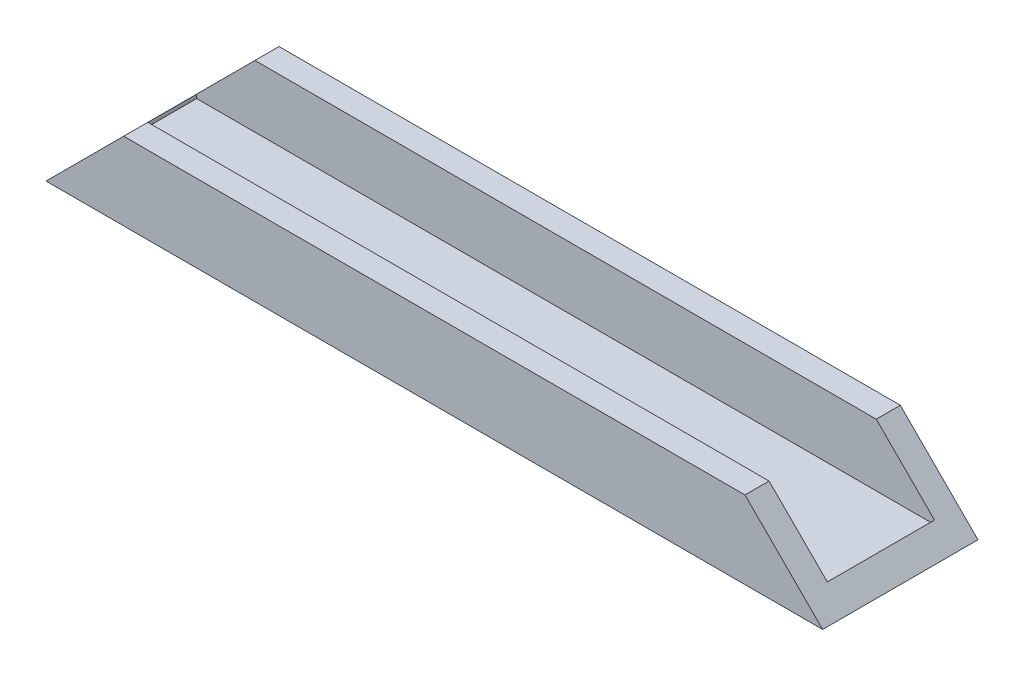
ISO-10303-21;
HEADER;
FILE_DESCRIPTION(('STEP AP214'),'2;1');
FILE_NAME('part.step','',(''),(''),'','','');
FILE_SCHEMA(('AUTOMOTIVE_DESIGN { 1 0 10303 214 1 1 1 1 }'));
ENDSEC;
DATA;
#1=APPLICATION_CONTEXT('core data for automotive mechanical design processes');
#2=APPLICATION_PROTOCOL_DEFINITION('international standard','automotive_design',2000,#1);
#3=PRODUCT_CONTEXT('',#1,'mechanical');
#4=PRODUCT('Part','Part','',(#3));
#5=PRODUCT_RELATED_PRODUCT_CATEGORY('part','',(#4));
#6=PRODUCT_DEFINITION_FORMATION('','',#4);
#7=PRODUCT_DEFINITION_CONTEXT('part definition',#1,'design');
#8=PRODUCT_DEFINITION('design','',#6,#7);
#9=PRODUCT_DEFINITION_SHAPE('','',#8);
#10=(LENGTH_UNIT() NAMED_UNIT(*) SI_UNIT(.MILLI.,.METRE.));
#11=(NAMED_UNIT(*) PLANE_ANGLE_UNIT() SI_UNIT($,.RADIAN.));
#12=(NAMED_UNIT(*) SI_UNIT($,.STERADIAN.) SOLID_ANGLE_UNIT());
#13=UNCERTAINTY_MEASURE_WITH_UNIT(LENGTH_MEASURE(1.E-05),#10,'distance_accuracy_value','');
#14=(GEOMETRIC_REPRESENTATION_CONTEXT(3) GLOBAL_UNCERTAINTY_ASSIGNED_CONTEXT((#13)) GLOBAL_UNIT_ASSIGNED_CONTEXT((#10,
#11,#12)) REPRESENTATION_CONTEXT('',''));
#15=CARTESIAN_POINT('',(0.,0.,0.));
#16=DIRECTION('',(0.,0.,1.));
#17=DIRECTION('',(1.,0.,0.));
#18=AXIS2_PLACEMENT_3D('',#15,#16,#17);
#19=CARTESIAN_POINT('',(0.,12.7,0.));
#20=DIRECTION('',(0.,-1.,0.));
#21=DIRECTION('',(0.,0.,-1.));
#22=AXIS2_PLACEMENT_3D('',#19,#20,#21);
#23=PLANE('',#22);
#24=DIRECTION('',(-1.,0.,0.));
#25=VECTOR('',#24,1.);
#26=CARTESIAN_POINT('',(0.,12.7,-25.4));
#27=LINE('',#26,#25);
#28=CARTESIAN_POINT('',(114.3,12.7,-25.4));
#29=VERTEX_POINT('',#28);
#30=CARTESIAN_POINT('',(12.7000000000001,12.7,-25.4));
#31=VERTEX_POINT('',#30);
#32=EDGE_CURVE('E128',#29,#31,#27,.T.);
#33=ORIENTED_EDGE('',*,*,#32,.T.);
#34=DIRECTION('',(0.,0.,-1.));
#35=VECTOR('',#34,1.);
#36=CARTESIAN_POINT('',(12.7000000000001,12.7,0.));
#37=LINE('',#36,#35);
#38=CARTESIAN_POINT('',(12.7000000000001,12.7,-21.463));
#39=VERTEX_POINT('',#38);
#40=EDGE_CURVE('E114',#39,#31,#37,.T.);
#41=ORIENTED_EDGE('',*,*,#40,.F.);
#42=DIRECTION('',(-1.,0.,0.));
#43=VECTOR('',#42,1.);
#44=CARTESIAN_POINT('',(3.175,12.7,-21.463));
#45=LINE('',#44,#43);
#46=CARTESIAN_POINT('',(114.3,12.7,-21.463));
#47=VERTEX_POINT('',#46);
#48=EDGE_CURVE('E163',#47,#39,#45,.T.);
#49=ORIENTED_EDGE('',*,*,#48,.F.);
#50=DIRECTION('',(0.,0.,-1.));
#51=VECTOR('',#50,1.);
#52=CARTESIAN_POINT('',(114.3,12.7,0.));
#53=LINE('',#52,#51);
#54=EDGE_CURVE('E187',#47,#29,#53,.T.);
#55=ORIENTED_EDGE('',*,*,#54,.T.);
#56=EDGE_LOOP('',(#33,#41,#49,#55));
#57=FACE_BOUND('',#56,.T.);
#58=ADVANCED_FACE('F32',(#57),#23,.F.);
#59=CARTESIAN_POINT('',(0.,12.7,0.));
#60=DIRECTION('',(0.,0.,-1.));
#61=DIRECTION('',(-1.,0.,0.));
#62=AXIS2_PLACEMENT_3D('',#59,#60,#61);
#63=PLANE('',#62);
#64=DIRECTION('',(1.,0.,0.));
#65=VECTOR('',#64,1.);
#66=CARTESIAN_POINT('',(0.,12.7,0.));
#67=LINE('',#66,#65);
#68=CARTESIAN_POINT('',(12.7000000000001,12.7,0.));
#69=VERTEX_POINT('',#68);
#70=CARTESIAN_POINT('',(114.3,12.7,0.));
#71=VERTEX_POINT('',#70);
#72=EDGE_CURVE('E122',#69,#71,#67,.T.);
#73=ORIENTED_EDGE('',*,*,#72,.F.);
#74=DIRECTION('',(-0.707106781186551,-0.707106781186544,0.));
#75=VECTOR('',#74,1.);
#76=CARTESIAN_POINT('',(0.,0.,0.));
#77=LINE('',#76,#75);
#78=CARTESIAN_POINT('',(0.,0.,0.));
#79=VERTEX_POINT('',#78);
#80=EDGE_CURVE('E106',#69,#79,#77,.T.);
#81=ORIENTED_EDGE('',*,*,#80,.T.);
#82=DIRECTION('',(1.,0.,0.));
#83=VECTOR('',#82,1.);
#84=CARTESIAN_POINT('',(0.,0.,0.));
#85=LINE('',#84,#83);
#86=CARTESIAN_POINT('',(127.,0.,0.));
#87=VERTEX_POINT('',#86);
#88=EDGE_CURVE('E141',#79,#87,#85,.T.);
#89=ORIENTED_EDGE('',*,*,#88,.T.);
#90=DIRECTION('',(-0.707106781186551,0.707106781186544,0.));
#91=VECTOR('',#90,1.);
#92=CARTESIAN_POINT('',(127.,0.,0.));
#93=LINE('',#92,#91);
#94=EDGE_CURVE('E127',#87,#71,#93,.T.);
#95=ORIENTED_EDGE('',*,*,#94,.T.);
#96=EDGE_LOOP('',(#73,#81,#89,#95));
#97=FACE_BOUND('',#96,.T.);
#98=ADVANCED_FACE('F34',(#97),#63,.F.);
#99=CARTESIAN_POINT('',(0.,12.7,-25.4));
#100=DIRECTION('',(0.,0.,1.));
#101=DIRECTION('',(1.,0.,0.));
#102=AXIS2_PLACEMENT_3D('',#99,#100,#101);
#103=PLANE('',#102);
#104=DIRECTION('',(-1.,0.,0.));
#105=VECTOR('',#104,1.);
#106=CARTESIAN_POINT('',(0.,0.,-25.4));
#107=LINE('',#106,#105);
#108=CARTESIAN_POINT('',(127.,0.,-25.4));
#109=VERTEX_POINT('',#108);
#110=CARTESIAN_POINT('',(0.,0.,-25.4));
#111=VERTEX_POINT('',#110);
#112=EDGE_CURVE('E129',#109,#111,#107,.T.);
#113=ORIENTED_EDGE('',*,*,#112,.T.);
#114=DIRECTION('',(-0.707106781186551,-0.707106781186544,0.));
#115=VECTOR('',#114,1.);
#116=CARTESIAN_POINT('',(0.,0.,-25.4));
#117=LINE('',#116,#115);
#118=EDGE_CURVE('E115',#31,#111,#117,.T.);
#119=ORIENTED_EDGE('',*,*,#118,.F.);
#120=ORIENTED_EDGE('',*,*,#32,.F.);
#121=DIRECTION('',(-0.707106781186551,0.707106781186544,0.));
#122=VECTOR('',#121,1.);
#123=CARTESIAN_POINT('',(127.,0.,-25.4));
#124=LINE('',#123,#122);
#125=EDGE_CURVE('E188',#109,#29,#124,.T.);
#126=ORIENTED_EDGE('',*,*,#125,.F.);
#127=EDGE_LOOP('',(#113,#119,#120,#126));
#128=FACE_BOUND('',#127,.T.);
#129=ADVANCED_FACE('F197',(#128),#103,.F.);
#130=DIRECTION('',(1.,0.,0.));
#131=VECTOR('',#130,1.);
#132=CARTESIAN_POINT('',(3.175,12.7,-3.93699999999999));
#133=LINE('',#132,#131);
#134=CARTESIAN_POINT('',(12.7000000000001,12.7,-3.93699999999999));
#135=VERTEX_POINT('',#134);
#136=CARTESIAN_POINT('',(114.3,12.7,-3.93699999999999));
#137=VERTEX_POINT('',#136);
#138=EDGE_CURVE('E124',#135,#137,#133,.T.);
#139=ORIENTED_EDGE('',*,*,#138,.F.);
#140=EDGE_CURVE('E55',#69,#135,#37,.T.);
#141=ORIENTED_EDGE('',*,*,#140,.F.);
#142=ORIENTED_EDGE('',*,*,#72,.T.);
#143=EDGE_CURVE('E185',#71,#137,#53,.T.);
#144=ORIENTED_EDGE('',*,*,#143,.T.);
#145=EDGE_LOOP('',(#139,#141,#142,#144));
#146=FACE_BOUND('',#145,.T.);
#147=ADVANCED_FACE('F120',(#146),#23,.F.);
#148=CARTESIAN_POINT('',(0.,0.,0.));
#149=DIRECTION('',(0.,-1.,0.));
#150=DIRECTION('',(0.,0.,-1.));
#151=AXIS2_PLACEMENT_3D('',#148,#149,#150);
#152=PLANE('',#151);
#153=DIRECTION('',(0.,0.,1.));
#154=VECTOR('',#153,1.);
#155=CARTESIAN_POINT('',(0.,0.,0.));
#156=LINE('',#155,#154);
#157=EDGE_CURVE('E109',#111,#79,#156,.T.);
#158=ORIENTED_EDGE('',*,*,#157,.F.);
#159=ORIENTED_EDGE('',*,*,#112,.F.);
#160=DIRECTION('',(0.,0.,-1.));
#161=VECTOR('',#160,1.);
#162=CARTESIAN_POINT('',(127.,0.,0.));
#163=LINE('',#162,#161);
#164=EDGE_CURVE('E134',#87,#109,#163,.T.);
#165=ORIENTED_EDGE('',*,*,#164,.F.);
#166=ORIENTED_EDGE('',*,*,#88,.F.);
#167=EDGE_LOOP('',(#158,#159,#165,#166));
#168=FACE_BOUND('',#167,.T.);
#169=ADVANCED_FACE('F200',(#168),#152,.T.);
#170=CARTESIAN_POINT('',(3.175,2.54,-21.463));
#171=DIRECTION('',(-1.,0.,0.));
#172=DIRECTION('',(0.,0.,1.));
#173=AXIS2_PLACEMENT_3D('',#170,#171,#172);
#174=PLANE('',#173);
#175=DIRECTION('',(0.,1.,0.));
#176=VECTOR('',#175,1.);
#177=CARTESIAN_POINT('',(3.175,2.54,-21.463));
#178=LINE('',#177,#176);
#179=CARTESIAN_POINT('',(3.175,2.54,-21.463));
#180=VERTEX_POINT('',#179);
#181=CARTESIAN_POINT('',(3.175,3.17499999999998,-21.463));
#182=VERTEX_POINT('',#181);
#183=EDGE_CURVE('E142',#180,#182,#178,.T.);
#184=ORIENTED_EDGE('',*,*,#183,.T.);
#185=DIRECTION('',(0.,0.,1.));
#186=VECTOR('',#185,1.);
#187=CARTESIAN_POINT('',(3.175,3.17499999999998,-21.463));
#188=LINE('',#187,#186);
#189=CARTESIAN_POINT('',(3.175,3.17499999999998,-3.93699999999999));
#190=VERTEX_POINT('',#189);
#191=EDGE_CURVE('E178',#182,#190,#188,.T.);
#192=ORIENTED_EDGE('',*,*,#191,.T.);
#193=DIRECTION('',(0.,1.,0.));
#194=VECTOR('',#193,1.);
#195=CARTESIAN_POINT('',(3.175,2.54,-3.93699999999999));
#196=LINE('',#195,#194);
#197=CARTESIAN_POINT('',(3.175,2.54,-3.93699999999999));
#198=VERTEX_POINT('',#197);
#199=EDGE_CURVE('E137',#198,#190,#196,.T.);
#200=ORIENTED_EDGE('',*,*,#199,.F.);
#201=DIRECTION('',(0.,0.,1.));
#202=VECTOR('',#201,1.);
#203=CARTESIAN_POINT('',(3.175,2.54,-21.463));
#204=LINE('',#203,#202);
#205=EDGE_CURVE('E166',#180,#198,#204,.T.);
#206=ORIENTED_EDGE('',*,*,#205,.F.);
#207=EDGE_LOOP('',(#184,#192,#200,#206));
#208=FACE_BOUND('',#207,.T.);
#209=ADVANCED_FACE('F212',(#208),#174,.F.);
#210=CARTESIAN_POINT('',(3.175,2.54,-21.463));
#211=DIRECTION('',(0.,0.,-1.));
#212=DIRECTION('',(-1.,0.,0.));
#213=AXIS2_PLACEMENT_3D('',#210,#211,#212);
#214=PLANE('',#213);
#215=ORIENTED_EDGE('',*,*,#48,.T.);
#216=DIRECTION('',(-0.707106781186551,-0.707106781186544,0.));
#217=VECTOR('',#216,1.);
#218=CARTESIAN_POINT('',(2.85750000000001,2.85749999999999,-21.463));
#219=LINE('',#218,#217);
#220=EDGE_CURVE('E168',#39,#182,#219,.T.);
#221=ORIENTED_EDGE('',*,*,#220,.T.);
#222=ORIENTED_EDGE('',*,*,#183,.F.);
#223=DIRECTION('',(-1.,0.,0.));
#224=VECTOR('',#223,1.);
#225=CARTESIAN_POINT('',(3.175,2.54,-21.463));
#226=LINE('',#225,#224);
#227=CARTESIAN_POINT('',(123.825,2.54,-21.463));
#228=VERTEX_POINT('',#227);
#229=EDGE_CURVE('E159',#228,#180,#226,.T.);
#230=ORIENTED_EDGE('',*,*,#229,.F.);
#231=DIRECTION('',(0.,1.,0.));
#232=VECTOR('',#231,1.);
#233=CARTESIAN_POINT('',(123.825,2.54,-21.463));
#234=LINE('',#233,#232);
#235=CARTESIAN_POINT('',(123.825,3.17499999999998,-21.463));
#236=VERTEX_POINT('',#235);
#237=EDGE_CURVE('E157',#228,#236,#234,.T.);
#238=ORIENTED_EDGE('',*,*,#237,.T.);
#239=DIRECTION('',(-0.707106781186551,0.707106781186544,0.));
#240=VECTOR('',#239,1.);
#241=CARTESIAN_POINT('',(63.8174999999994,63.1825,-21.463));
#242=LINE('',#241,#240);
#243=EDGE_CURVE('E181',#236,#47,#242,.T.);
#244=ORIENTED_EDGE('',*,*,#243,.T.);
#245=EDGE_LOOP('',(#215,#221,#222,#230,#238,#244));
#246=FACE_BOUND('',#245,.T.);
#247=ADVANCED_FACE('F206',(#246),#214,.F.);
#248=CARTESIAN_POINT('',(123.825,2.54,-21.463));
#249=DIRECTION('',(1.,0.,0.));
#250=DIRECTION('',(0.,0.,-1.));
#251=AXIS2_PLACEMENT_3D('',#248,#249,#250);
#252=PLANE('',#251);
#253=DIRECTION('',(0.,1.,0.));
#254=VECTOR('',#253,1.);
#255=CARTESIAN_POINT('',(123.825,2.54,-3.93699999999999));
#256=LINE('',#255,#254);
#257=CARTESIAN_POINT('',(123.825,2.54,-3.93699999999999));
#258=VERTEX_POINT('',#257);
#259=CARTESIAN_POINT('',(123.825,3.17499999999997,-3.93699999999999));
#260=VERTEX_POINT('',#259);
#261=EDGE_CURVE('E149',#258,#260,#256,.T.);
#262=ORIENTED_EDGE('',*,*,#261,.T.);
#263=DIRECTION('',(0.,0.,-1.));
#264=VECTOR('',#263,1.);
#265=CARTESIAN_POINT('',(123.825,3.17499999999998,-21.463));
#266=LINE('',#265,#264);
#267=EDGE_CURVE('E47',#260,#236,#266,.T.);
#268=ORIENTED_EDGE('',*,*,#267,.T.);
#269=ORIENTED_EDGE('',*,*,#237,.F.);
#270=DIRECTION('',(0.,0.,-1.));
#271=VECTOR('',#270,1.);
#272=CARTESIAN_POINT('',(123.825,2.54,-21.463));
#273=LINE('',#272,#271);
#274=EDGE_CURVE('E155',#258,#228,#273,.T.);
#275=ORIENTED_EDGE('',*,*,#274,.F.);
#276=EDGE_LOOP('',(#262,#268,#269,#275));
#277=FACE_BOUND('',#276,.T.);
#278=ADVANCED_FACE('F152',(#277),#252,.F.);
#279=CARTESIAN_POINT('',(3.175,2.54,-3.93699999999999));
#280=DIRECTION('',(0.,0.,1.));
#281=DIRECTION('',(1.,0.,0.));
#282=AXIS2_PLACEMENT_3D('',#279,#280,#281);
#283=PLANE('',#282);
#284=ORIENTED_EDGE('',*,*,#199,.T.);
#285=DIRECTION('',(0.707106781186551,0.707106781186544,0.));
#286=VECTOR('',#285,1.);
#287=CARTESIAN_POINT('',(2.85750000000001,2.85749999999999,-3.93699999999999));
#288=LINE('',#287,#286);
#289=EDGE_CURVE('E11',#190,#135,#288,.T.);
#290=ORIENTED_EDGE('',*,*,#289,.T.);
#291=ORIENTED_EDGE('',*,*,#138,.T.);
#292=DIRECTION('',(0.707106781186551,-0.707106781186544,0.));
#293=VECTOR('',#292,1.);
#294=CARTESIAN_POINT('',(63.8174999999994,63.1825,-3.93699999999999));
#295=LINE('',#294,#293);
#296=EDGE_CURVE('E40',#137,#260,#295,.T.);
#297=ORIENTED_EDGE('',*,*,#296,.T.);
#298=ORIENTED_EDGE('',*,*,#261,.F.);
#299=DIRECTION('',(1.,0.,0.));
#300=VECTOR('',#299,1.);
#301=CARTESIAN_POINT('',(3.175,2.54,-3.93699999999999));
#302=LINE('',#301,#300);
#303=EDGE_CURVE('E172',#198,#258,#302,.T.);
#304=ORIENTED_EDGE('',*,*,#303,.F.);
#305=EDGE_LOOP('',(#284,#290,#291,#297,#298,#304));
#306=FACE_BOUND('',#305,.T.);
#307=ADVANCED_FACE('F147',(#306),#283,.F.);
#308=CARTESIAN_POINT('',(0.,2.54,0.));
#309=DIRECTION('',(0.,1.,0.));
#310=DIRECTION('',(0.,0.,1.));
#311=AXIS2_PLACEMENT_3D('',#308,#309,#310);
#312=PLANE('',#311);
#313=ORIENTED_EDGE('',*,*,#205,.T.);
#314=ORIENTED_EDGE('',*,*,#303,.T.);
#315=ORIENTED_EDGE('',*,*,#274,.T.);
#316=ORIENTED_EDGE('',*,*,#229,.T.);
#317=EDGE_LOOP('',(#313,#314,#315,#316));
#318=FACE_BOUND('',#317,.T.);
#319=ADVANCED_FACE('F209',(#318),#312,.T.);
#320=CARTESIAN_POINT('',(127.,0.,0.));
#321=DIRECTION('',(-0.707106781186544,-0.707106781186551,0.));
#322=DIRECTION('',(0.707106781186551,-0.707106781186544,0.));
#323=AXIS2_PLACEMENT_3D('',#320,#321,#322);
#324=PLANE('',#323);
#325=ORIENTED_EDGE('',*,*,#267,.F.);
#326=ORIENTED_EDGE('',*,*,#296,.F.);
#327=ORIENTED_EDGE('',*,*,#143,.F.);
#328=ORIENTED_EDGE('',*,*,#94,.F.);
#329=ORIENTED_EDGE('',*,*,#164,.T.);
#330=ORIENTED_EDGE('',*,*,#125,.T.);
#331=ORIENTED_EDGE('',*,*,#54,.F.);
#332=ORIENTED_EDGE('',*,*,#243,.F.);
#333=EDGE_LOOP('',(#325,#326,#327,#328,#329,#330,#331,#332));
#334=FACE_BOUND('',#333,.T.);
#335=ADVANCED_FACE('F201',(#334),#324,.F.);
#336=CARTESIAN_POINT('',(0.,0.,0.));
#337=DIRECTION('',(0.707106781186544,-0.707106781186551,0.));
#338=DIRECTION('',(0.707106781186551,0.707106781186544,0.));
#339=AXIS2_PLACEMENT_3D('',#336,#337,#338);
#340=PLANE('',#339);
#341=ORIENTED_EDGE('',*,*,#40,.T.);
#342=ORIENTED_EDGE('',*,*,#118,.T.);
#343=ORIENTED_EDGE('',*,*,#157,.T.);
#344=ORIENTED_EDGE('',*,*,#80,.F.);
#345=ORIENTED_EDGE('',*,*,#140,.T.);
#346=ORIENTED_EDGE('',*,*,#289,.F.);
#347=ORIENTED_EDGE('',*,*,#191,.F.);
#348=ORIENTED_EDGE('',*,*,#220,.F.);
#349=EDGE_LOOP('',(#341,#342,#343,#344,#345,#346,#347,#348));
#350=FACE_BOUND('',#349,.T.);
#351=ADVANCED_FACE('F107',(#350),#340,.F.);
#352=CLOSED_SHELL('',(#58,#98,#129,#147,#169,#209,#247,#278,#307,#319,#335,#351));
#353=MANIFOLD_SOLID_BREP('B2',#352);
#354=ADVANCED_BREP_SHAPE_REPRESENTATION('',(#18,#353),#14);
#355=SHAPE_DEFINITION_REPRESENTATION(#9,#354);
ENDSEC;
END-ISO-10303-21;
